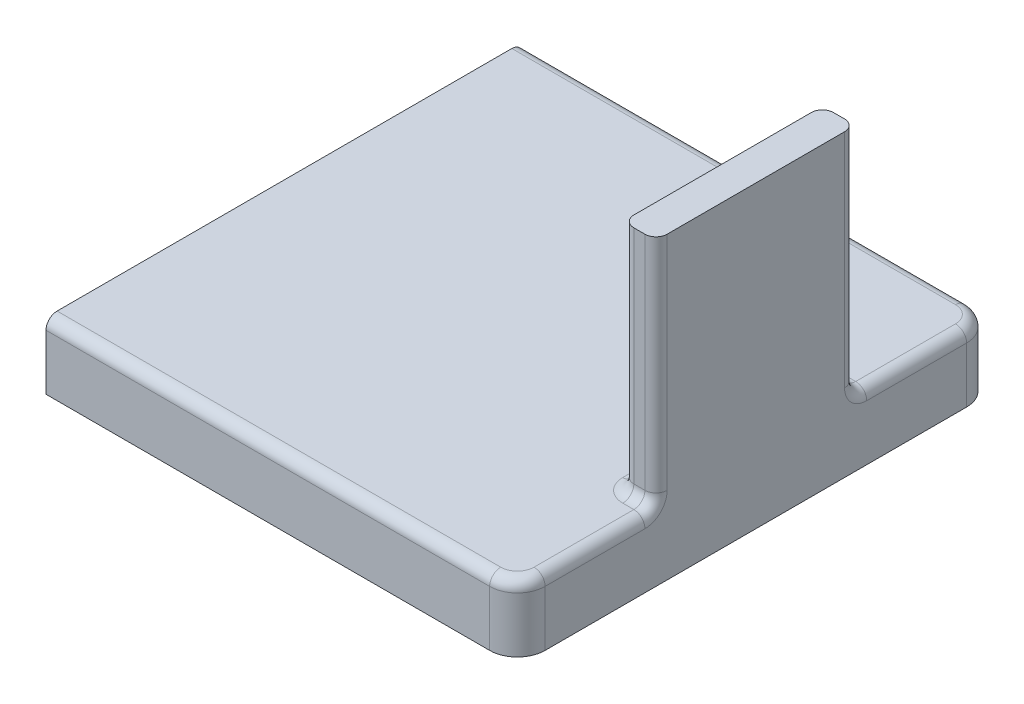
ISO-10303-21;
HEADER;
FILE_DESCRIPTION(('STEP AP214'),'2;1');
FILE_NAME('part.step','',(''),(''),'','','');
FILE_SCHEMA(('AUTOMOTIVE_DESIGN { 1 0 10303 214 1 1 1 1 }'));
ENDSEC;
DATA;
#1=APPLICATION_CONTEXT('core data for automotive mechanical design processes');
#2=APPLICATION_PROTOCOL_DEFINITION('international standard','automotive_design',2000,#1);
#3=PRODUCT_CONTEXT('',#1,'mechanical');
#4=PRODUCT('Part','Part','',(#3));
#5=PRODUCT_RELATED_PRODUCT_CATEGORY('part','',(#4));
#6=PRODUCT_DEFINITION_FORMATION('','',#4);
#7=PRODUCT_DEFINITION_CONTEXT('part definition',#1,'design');
#8=PRODUCT_DEFINITION('design','',#6,#7);
#9=PRODUCT_DEFINITION_SHAPE('','',#8);
#10=(LENGTH_UNIT() NAMED_UNIT(*) SI_UNIT(.MILLI.,.METRE.));
#11=(NAMED_UNIT(*) PLANE_ANGLE_UNIT() SI_UNIT($,.RADIAN.));
#12=(NAMED_UNIT(*) SI_UNIT($,.STERADIAN.) SOLID_ANGLE_UNIT());
#13=UNCERTAINTY_MEASURE_WITH_UNIT(LENGTH_MEASURE(1.E-05),#10,'distance_accuracy_value','');
#14=(GEOMETRIC_REPRESENTATION_CONTEXT(3) GLOBAL_UNCERTAINTY_ASSIGNED_CONTEXT((#13)) GLOBAL_UNIT_ASSIGNED_CONTEXT((#10,
#11,#12)) REPRESENTATION_CONTEXT('',''));
#15=CARTESIAN_POINT('',(0.,0.,0.));
#16=DIRECTION('',(0.,0.,1.));
#17=DIRECTION('',(1.,0.,0.));
#18=AXIS2_PLACEMENT_3D('',#15,#16,#17);
#19=CARTESIAN_POINT('',(85.,-42.,43.));
#20=DIRECTION('',(0.,-1.,0.));
#21=DIRECTION('',(1.,0.,0.));
#22=AXIS2_PLACEMENT_3D('',#19,#20,#21);
#23=PLANE('',#22);
#24=CARTESIAN_POINT('',(80.,-42.,-38.));
#25=DIRECTION('',(0.,-1.,0.));
#26=DIRECTION('',(1.,0.,0.));
#27=AXIS2_PLACEMENT_3D('',#24,#25,#26);
#28=CIRCLE('',#27,3.);
#29=CARTESIAN_POINT('',(83.,-42.,-38.));
#30=VERTEX_POINT('',#29);
#31=CARTESIAN_POINT('',(80.,-42.,-41.));
#32=VERTEX_POINT('',#31);
#33=EDGE_CURVE('E249',#30,#32,#28,.F.);
#34=ORIENTED_EDGE('',*,*,#33,.T.);
#35=DIRECTION('',(-1.,0.,0.));
#36=VECTOR('',#35,1.);
#37=CARTESIAN_POINT('',(85.,-42.,-41.));
#38=LINE('',#37,#36);
#39=CARTESIAN_POINT('',(0.,-42.,-41.));
#40=VERTEX_POINT('',#39);
#41=EDGE_CURVE('E251',#32,#40,#38,.T.);
#42=ORIENTED_EDGE('',*,*,#41,.T.);
#43=DIRECTION('',(0.,0.,-1.));
#44=VECTOR('',#43,1.);
#45=CARTESIAN_POINT('',(0.,-42.,43.));
#46=LINE('',#45,#44);
#47=CARTESIAN_POINT('',(0.,-42.,41.));
#48=VERTEX_POINT('',#47);
#49=EDGE_CURVE('E201',#48,#40,#46,.T.);
#50=ORIENTED_EDGE('',*,*,#49,.F.);
#51=DIRECTION('',(-1.,0.,0.));
#52=VECTOR('',#51,1.);
#53=CARTESIAN_POINT('',(80.,-42.,41.));
#54=LINE('',#53,#52);
#55=CARTESIAN_POINT('',(80.,-42.,41.));
#56=VERTEX_POINT('',#55);
#57=EDGE_CURVE('E235',#48,#56,#54,.F.);
#58=ORIENTED_EDGE('',*,*,#57,.T.);
#59=CARTESIAN_POINT('',(80.,-42.,38.));
#60=DIRECTION('',(0.,-1.,0.));
#61=DIRECTION('',(1.,0.,0.));
#62=AXIS2_PLACEMENT_3D('',#59,#60,#61);
#63=CIRCLE('',#62,3.);
#64=CARTESIAN_POINT('',(83.,-42.,38.));
#65=VERTEX_POINT('',#64);
#66=EDGE_CURVE('E233',#56,#65,#63,.F.);
#67=ORIENTED_EDGE('',*,*,#66,.T.);
#68=DIRECTION('',(0.,0.,-1.));
#69=VECTOR('',#68,1.);
#70=CARTESIAN_POINT('',(83.,-42.,43.));
#71=LINE('',#70,#69);
#72=CARTESIAN_POINT('',(83.,-42.,20.));
#73=VERTEX_POINT('',#72);
#74=EDGE_CURVE('E229',#65,#73,#71,.T.);
#75=ORIENTED_EDGE('',*,*,#74,.T.);
#76=DIRECTION('',(1.,0.,0.));
#77=VECTOR('',#76,1.);
#78=CARTESIAN_POINT('',(85.,-42.,20.));
#79=LINE('',#78,#77);
#80=CARTESIAN_POINT('',(81.,-42.,20.));
#81=VERTEX_POINT('',#80);
#82=EDGE_CURVE('E231',#73,#81,#79,.F.);
#83=ORIENTED_EDGE('',*,*,#82,.T.);
#84=CARTESIAN_POINT('',(81.,-42.,16.));
#85=DIRECTION('',(0.,-1.,0.));
#86=DIRECTION('',(1.,0.,0.));
#87=AXIS2_PLACEMENT_3D('',#84,#85,#86);
#88=CIRCLE('',#87,4.);
#89=CARTESIAN_POINT('',(77.,-42.,16.));
#90=VERTEX_POINT('',#89);
#91=EDGE_CURVE('E237',#90,#81,#88,.F.);
#92=ORIENTED_EDGE('',*,*,#91,.F.);
#93=DIRECTION('',(0.,0.,-1.));
#94=VECTOR('',#93,1.);
#95=CARTESIAN_POINT('',(77.,-42.,-18.));
#96=LINE('',#95,#94);
#97=CARTESIAN_POINT('',(77.,-42.,-16.));
#98=VERTEX_POINT('',#97);
#99=EDGE_CURVE('E240',#90,#98,#96,.T.);
#100=ORIENTED_EDGE('',*,*,#99,.T.);
#101=CARTESIAN_POINT('',(81.,-42.,-16.));
#102=DIRECTION('',(0.,-1.,0.));
#103=DIRECTION('',(1.,0.,0.));
#104=AXIS2_PLACEMENT_3D('',#101,#102,#103);
#105=CIRCLE('',#104,4.);
#106=CARTESIAN_POINT('',(81.,-42.,-20.));
#107=VERTEX_POINT('',#106);
#108=EDGE_CURVE('E242',#107,#98,#105,.F.);
#109=ORIENTED_EDGE('',*,*,#108,.F.);
#110=DIRECTION('',(1.,0.,0.));
#111=VECTOR('',#110,1.);
#112=CARTESIAN_POINT('',(85.,-42.,-20.));
#113=LINE('',#112,#111);
#114=CARTESIAN_POINT('',(83.,-42.,-20.));
#115=VERTEX_POINT('',#114);
#116=EDGE_CURVE('E245',#107,#115,#113,.T.);
#117=ORIENTED_EDGE('',*,*,#116,.T.);
#118=DIRECTION('',(0.,0.,-1.));
#119=VECTOR('',#118,1.);
#120=CARTESIAN_POINT('',(83.,-42.,43.));
#121=LINE('',#120,#119);
#122=EDGE_CURVE('E247',#115,#30,#121,.T.);
#123=ORIENTED_EDGE('',*,*,#122,.T.);
#124=EDGE_LOOP('',(#34,#42,#50,#58,#67,#75,#83,#92,#100,#109,#117,#123));
#125=FACE_BOUND('',#124,.T.);
#126=ADVANCED_FACE('F36',(#125),#23,.F.);
#127=CARTESIAN_POINT('',(0.,-42.,43.));
#128=DIRECTION('',(1.,0.,0.));
#129=DIRECTION('',(0.,1.,0.));
#130=AXIS2_PLACEMENT_3D('',#127,#128,#129);
#131=PLANE('',#130);
#132=ORIENTED_EDGE('',*,*,#49,.T.);
#133=CARTESIAN_POINT('',(0.,-44.,-41.));
#134=DIRECTION('',(1.,0.,0.));
#135=DIRECTION('',(0.,1.,0.));
#136=AXIS2_PLACEMENT_3D('',#133,#134,#135);
#137=CIRCLE('',#136,2.);
#138=CARTESIAN_POINT('',(0.,-44.,-43.));
#139=VERTEX_POINT('',#138);
#140=EDGE_CURVE('E256',#40,#139,#137,.F.);
#141=ORIENTED_EDGE('',*,*,#140,.T.);
#142=DIRECTION('',(0.,-1.,0.));
#143=VECTOR('',#142,1.);
#144=CARTESIAN_POINT('',(0.,-42.,-43.));
#145=LINE('',#144,#143);
#146=CARTESIAN_POINT('',(0.,-54.,-43.));
#147=VERTEX_POINT('',#146);
#148=EDGE_CURVE('E197',#139,#147,#145,.T.);
#149=ORIENTED_EDGE('',*,*,#148,.T.);
#150=DIRECTION('',(0.,0.,-1.));
#151=VECTOR('',#150,1.);
#152=CARTESIAN_POINT('',(0.,-54.,43.));
#153=LINE('',#152,#151);
#154=CARTESIAN_POINT('',(0.,-54.,43.));
#155=VERTEX_POINT('',#154);
#156=EDGE_CURVE('E193',#155,#147,#153,.T.);
#157=ORIENTED_EDGE('',*,*,#156,.F.);
#158=DIRECTION('',(0.,-1.,0.));
#159=VECTOR('',#158,1.);
#160=CARTESIAN_POINT('',(0.,-42.,43.));
#161=LINE('',#160,#159);
#162=CARTESIAN_POINT('',(0.,-44.,43.));
#163=VERTEX_POINT('',#162);
#164=EDGE_CURVE('E179',#163,#155,#161,.T.);
#165=ORIENTED_EDGE('',*,*,#164,.F.);
#166=CARTESIAN_POINT('',(0.,-44.,41.));
#167=DIRECTION('',(1.,0.,0.));
#168=DIRECTION('',(0.,1.,0.));
#169=AXIS2_PLACEMENT_3D('',#166,#167,#168);
#170=CIRCLE('',#169,2.);
#171=EDGE_CURVE('E254',#163,#48,#170,.F.);
#172=ORIENTED_EDGE('',*,*,#171,.T.);
#173=EDGE_LOOP('',(#132,#141,#149,#157,#165,#172));
#174=FACE_BOUND('',#173,.T.);
#175=ADVANCED_FACE('F195',(#174),#131,.F.);
#176=CARTESIAN_POINT('',(0.,-54.,43.));
#177=DIRECTION('',(0.,1.,0.));
#178=DIRECTION('',(-1.,0.,0.));
#179=AXIS2_PLACEMENT_3D('',#176,#177,#178);
#180=PLANE('',#179);
#181=DIRECTION('',(1.,0.,0.));
#182=VECTOR('',#181,1.);
#183=CARTESIAN_POINT('',(0.,-54.,-43.));
#184=LINE('',#183,#182);
#185=CARTESIAN_POINT('',(80.,-54.,-43.));
#186=VERTEX_POINT('',#185);
#187=EDGE_CURVE('E190',#147,#186,#184,.T.);
#188=ORIENTED_EDGE('',*,*,#187,.T.);
#189=CARTESIAN_POINT('',(80.,-54.,-38.));
#190=DIRECTION('',(0.,1.,0.));
#191=DIRECTION('',(-1.,0.,0.));
#192=AXIS2_PLACEMENT_3D('',#189,#190,#191);
#193=CIRCLE('',#192,5.);
#194=CARTESIAN_POINT('',(85.,-54.,-38.));
#195=VERTEX_POINT('',#194);
#196=EDGE_CURVE('E225',#186,#195,#193,.F.);
#197=ORIENTED_EDGE('',*,*,#196,.T.);
#198=DIRECTION('',(0.,0.,-1.));
#199=VECTOR('',#198,1.);
#200=CARTESIAN_POINT('',(85.,-54.,43.));
#201=LINE('',#200,#199);
#202=CARTESIAN_POINT('',(85.,-54.,38.));
#203=VERTEX_POINT('',#202);
#204=EDGE_CURVE('E202',#203,#195,#201,.T.);
#205=ORIENTED_EDGE('',*,*,#204,.F.);
#206=CARTESIAN_POINT('',(80.,-54.,38.));
#207=DIRECTION('',(0.,1.,0.));
#208=DIRECTION('',(-1.,0.,0.));
#209=AXIS2_PLACEMENT_3D('',#206,#207,#208);
#210=CIRCLE('',#209,5.);
#211=CARTESIAN_POINT('',(80.,-54.,43.));
#212=VERTEX_POINT('',#211);
#213=EDGE_CURVE('E207',#203,#212,#210,.F.);
#214=ORIENTED_EDGE('',*,*,#213,.T.);
#215=DIRECTION('',(1.,0.,0.));
#216=VECTOR('',#215,1.);
#217=CARTESIAN_POINT('',(0.,-54.,43.));
#218=LINE('',#217,#216);
#219=EDGE_CURVE('E184',#155,#212,#218,.T.);
#220=ORIENTED_EDGE('',*,*,#219,.F.);
#221=ORIENTED_EDGE('',*,*,#156,.T.);
#222=EDGE_LOOP('',(#188,#197,#205,#214,#220,#221));
#223=FACE_BOUND('',#222,.T.);
#224=ADVANCED_FACE('F204',(#223),#180,.F.);
#225=CARTESIAN_POINT('',(85.,-42.,43.));
#226=DIRECTION('',(-1.,0.,0.));
#227=DIRECTION('',(0.,-1.,0.));
#228=AXIS2_PLACEMENT_3D('',#225,#226,#227);
#229=PLANE('',#228);
#230=DIRECTION('',(0.,1.,0.));
#231=VECTOR('',#230,1.);
#232=CARTESIAN_POINT('',(85.,-42.,-38.));
#233=LINE('',#232,#231);
#234=CARTESIAN_POINT('',(85.,-44.,-38.));
#235=VERTEX_POINT('',#234);
#236=EDGE_CURVE('E219',#195,#235,#233,.T.);
#237=ORIENTED_EDGE('',*,*,#236,.T.);
#238=DIRECTION('',(0.,0.,-1.));
#239=VECTOR('',#238,1.);
#240=CARTESIAN_POINT('',(85.,-44.,43.));
#241=LINE('',#240,#239);
#242=CARTESIAN_POINT('',(85.,-44.,-20.));
#243=VERTEX_POINT('',#242);
#244=EDGE_CURVE('E274',#235,#243,#241,.F.);
#245=ORIENTED_EDGE('',*,*,#244,.T.);
#246=CARTESIAN_POINT('',(85.,-40.,-20.));
#247=DIRECTION('',(-1.,0.,0.));
#248=DIRECTION('',(0.,-1.,0.));
#249=AXIS2_PLACEMENT_3D('',#246,#247,#248);
#250=CIRCLE('',#249,4.);
#251=CARTESIAN_POINT('',(85.,-40.,-16.));
#252=VERTEX_POINT('',#251);
#253=EDGE_CURVE('E271',#252,#243,#250,.F.);
#254=ORIENTED_EDGE('',*,*,#253,.F.);
#255=DIRECTION('',(0.,1.,0.));
#256=VECTOR('',#255,1.);
#257=CARTESIAN_POINT('',(85.,-42.,-16.));
#258=LINE('',#257,#256);
#259=CARTESIAN_POINT('',(85.,0.,-16.));
#260=VERTEX_POINT('',#259);
#261=EDGE_CURVE('E269',#252,#260,#258,.T.);
#262=ORIENTED_EDGE('',*,*,#261,.T.);
#263=DIRECTION('',(0.,0.,-1.));
#264=VECTOR('',#263,1.);
#265=CARTESIAN_POINT('',(85.,0.,18.));
#266=LINE('',#265,#264);
#267=CARTESIAN_POINT('',(85.,0.,16.));
#268=VERTEX_POINT('',#267);
#269=EDGE_CURVE('E214',#268,#260,#266,.T.);
#270=ORIENTED_EDGE('',*,*,#269,.F.);
#271=DIRECTION('',(0.,1.,0.));
#272=VECTOR('',#271,1.);
#273=CARTESIAN_POINT('',(85.,-42.,16.));
#274=LINE('',#273,#272);
#275=CARTESIAN_POINT('',(85.,-40.,16.));
#276=VERTEX_POINT('',#275);
#277=EDGE_CURVE('E265',#268,#276,#274,.F.);
#278=ORIENTED_EDGE('',*,*,#277,.T.);
#279=CARTESIAN_POINT('',(85.,-40.,20.));
#280=DIRECTION('',(-1.,0.,0.));
#281=DIRECTION('',(0.,-1.,0.));
#282=AXIS2_PLACEMENT_3D('',#279,#280,#281);
#283=CIRCLE('',#282,4.);
#284=CARTESIAN_POINT('',(85.,-44.,20.));
#285=VERTEX_POINT('',#284);
#286=EDGE_CURVE('E262',#285,#276,#283,.F.);
#287=ORIENTED_EDGE('',*,*,#286,.F.);
#288=DIRECTION('',(0.,0.,-1.));
#289=VECTOR('',#288,1.);
#290=CARTESIAN_POINT('',(85.,-44.,43.));
#291=LINE('',#290,#289);
#292=CARTESIAN_POINT('',(85.,-44.,38.));
#293=VERTEX_POINT('',#292);
#294=EDGE_CURVE('E267',#285,#293,#291,.F.);
#295=ORIENTED_EDGE('',*,*,#294,.T.);
#296=DIRECTION('',(0.,1.,0.));
#297=VECTOR('',#296,1.);
#298=CARTESIAN_POINT('',(85.,-54.,38.));
#299=LINE('',#298,#297);
#300=EDGE_CURVE('E217',#293,#203,#299,.F.);
#301=ORIENTED_EDGE('',*,*,#300,.T.);
#302=ORIENTED_EDGE('',*,*,#204,.T.);
#303=EDGE_LOOP('',(#237,#245,#254,#262,#270,#278,#287,#295,#301,#302));
#304=FACE_BOUND('',#303,.T.);
#305=ADVANCED_FACE('F504',(#304),#229,.F.);
#306=CARTESIAN_POINT('',(0.,-42.,43.));
#307=DIRECTION('',(0.,0.,1.));
#308=DIRECTION('',(1.,0.,0.));
#309=AXIS2_PLACEMENT_3D('',#306,#307,#308);
#310=PLANE('',#309);
#311=DIRECTION('',(0.,1.,0.));
#312=VECTOR('',#311,1.);
#313=CARTESIAN_POINT('',(80.,-42.,43.));
#314=LINE('',#313,#312);
#315=CARTESIAN_POINT('',(80.,-44.,43.));
#316=VERTEX_POINT('',#315);
#317=EDGE_CURVE('E227',#212,#316,#314,.T.);
#318=ORIENTED_EDGE('',*,*,#317,.T.);
#319=DIRECTION('',(-1.,0.,0.));
#320=VECTOR('',#319,1.);
#321=CARTESIAN_POINT('',(0.,-44.,43.));
#322=LINE('',#321,#320);
#323=EDGE_CURVE('E187',#316,#163,#322,.T.);
#324=ORIENTED_EDGE('',*,*,#323,.T.);
#325=ORIENTED_EDGE('',*,*,#164,.T.);
#326=ORIENTED_EDGE('',*,*,#219,.T.);
#327=EDGE_LOOP('',(#318,#324,#325,#326));
#328=FACE_BOUND('',#327,.T.);
#329=ADVANCED_FACE('F182',(#328),#310,.T.);
#330=CARTESIAN_POINT('',(0.,-42.,-43.));
#331=DIRECTION('',(0.,0.,1.));
#332=DIRECTION('',(1.,0.,0.));
#333=AXIS2_PLACEMENT_3D('',#330,#331,#332);
#334=PLANE('',#333);
#335=ORIENTED_EDGE('',*,*,#148,.F.);
#336=DIRECTION('',(-1.,0.,0.));
#337=VECTOR('',#336,1.);
#338=CARTESIAN_POINT('',(0.,-44.,-43.));
#339=LINE('',#338,#337);
#340=CARTESIAN_POINT('',(80.,-44.,-43.));
#341=VERTEX_POINT('',#340);
#342=EDGE_CURVE('E258',#139,#341,#339,.F.);
#343=ORIENTED_EDGE('',*,*,#342,.T.);
#344=DIRECTION('',(0.,1.,0.));
#345=VECTOR('',#344,1.);
#346=CARTESIAN_POINT('',(80.,-41.9999999999999,-43.));
#347=LINE('',#346,#345);
#348=EDGE_CURVE('E222',#341,#186,#347,.F.);
#349=ORIENTED_EDGE('',*,*,#348,.T.);
#350=ORIENTED_EDGE('',*,*,#187,.F.);
#351=EDGE_LOOP('',(#335,#343,#349,#350));
#352=FACE_BOUND('',#351,.T.);
#353=ADVANCED_FACE('F498',(#352),#334,.F.);
#354=CARTESIAN_POINT('',(85.,0.,18.));
#355=DIRECTION('',(0.,-1.,0.));
#356=DIRECTION('',(1.,0.,0.));
#357=AXIS2_PLACEMENT_3D('',#354,#355,#356);
#358=PLANE('',#357);
#359=DIRECTION('',(-1.,0.,0.));
#360=VECTOR('',#359,1.);
#361=CARTESIAN_POINT('',(85.,0.,-18.));
#362=LINE('',#361,#360);
#363=CARTESIAN_POINT('',(82.9999999999999,0.,-18.));
#364=VERTEX_POINT('',#363);
#365=CARTESIAN_POINT('',(81.,0.,-18.));
#366=VERTEX_POINT('',#365);
#367=EDGE_CURVE('E348',#364,#366,#362,.T.);
#368=ORIENTED_EDGE('',*,*,#367,.T.);
#369=CARTESIAN_POINT('',(81.,0.,-16.));
#370=DIRECTION('',(0.,-1.,0.));
#371=DIRECTION('',(1.,0.,0.));
#372=AXIS2_PLACEMENT_3D('',#369,#370,#371);
#373=CIRCLE('',#372,2.);
#374=CARTESIAN_POINT('',(79.,0.,-16.));
#375=VERTEX_POINT('',#374);
#376=EDGE_CURVE('E11',#366,#375,#373,.F.);
#377=ORIENTED_EDGE('',*,*,#376,.T.);
#378=DIRECTION('',(0.,0.,-1.));
#379=VECTOR('',#378,1.);
#380=CARTESIAN_POINT('',(79.,0.,18.));
#381=LINE('',#380,#379);
#382=CARTESIAN_POINT('',(79.,0.,16.));
#383=VERTEX_POINT('',#382);
#384=EDGE_CURVE('E359',#383,#375,#381,.T.);
#385=ORIENTED_EDGE('',*,*,#384,.F.);
#386=CARTESIAN_POINT('',(81.,0.,16.));
#387=DIRECTION('',(0.,-1.,0.));
#388=DIRECTION('',(1.,0.,0.));
#389=AXIS2_PLACEMENT_3D('',#386,#387,#388);
#390=CIRCLE('',#389,2.);
#391=CARTESIAN_POINT('',(81.,0.,18.));
#392=VERTEX_POINT('',#391);
#393=EDGE_CURVE('E295',#383,#392,#390,.F.);
#394=ORIENTED_EDGE('',*,*,#393,.T.);
#395=DIRECTION('',(-1.,0.,0.));
#396=VECTOR('',#395,1.);
#397=CARTESIAN_POINT('',(85.,0.,18.));
#398=LINE('',#397,#396);
#399=CARTESIAN_POINT('',(82.9999999999999,0.,18.));
#400=VERTEX_POINT('',#399);
#401=EDGE_CURVE('E354',#400,#392,#398,.T.);
#402=ORIENTED_EDGE('',*,*,#401,.F.);
#403=CARTESIAN_POINT('',(82.9999999999999,0.,16.));
#404=DIRECTION('',(0.,-1.,0.));
#405=DIRECTION('',(1.,0.,0.));
#406=AXIS2_PLACEMENT_3D('',#403,#404,#405);
#407=CIRCLE('',#406,2.);
#408=EDGE_CURVE('E297',#400,#268,#407,.F.);
#409=ORIENTED_EDGE('',*,*,#408,.T.);
#410=ORIENTED_EDGE('',*,*,#269,.T.);
#411=CARTESIAN_POINT('',(82.9999999999999,0.,-16.));
#412=DIRECTION('',(0.,-1.,0.));
#413=DIRECTION('',(1.,0.,0.));
#414=AXIS2_PLACEMENT_3D('',#411,#412,#413);
#415=CIRCLE('',#414,2.);
#416=EDGE_CURVE('E45',#260,#364,#415,.F.);
#417=ORIENTED_EDGE('',*,*,#416,.T.);
#418=EDGE_LOOP('',(#368,#377,#385,#394,#402,#409,#410,#417));
#419=FACE_BOUND('',#418,.T.);
#420=ADVANCED_FACE('F366',(#419),#358,.F.);
#421=CARTESIAN_POINT('',(79.,0.,18.));
#422=DIRECTION('',(1.,0.,0.));
#423=DIRECTION('',(0.,0.,-1.));
#424=AXIS2_PLACEMENT_3D('',#421,#422,#423);
#425=PLANE('',#424);
#426=ORIENTED_EDGE('',*,*,#384,.T.);
#427=DIRECTION('',(0.,-1.,0.));
#428=VECTOR('',#427,1.);
#429=CARTESIAN_POINT('',(79.,0.,-16.));
#430=LINE('',#429,#428);
#431=CARTESIAN_POINT('',(79.,-40.,-16.));
#432=VERTEX_POINT('',#431);
#433=EDGE_CURVE('E286',#375,#432,#430,.T.);
#434=ORIENTED_EDGE('',*,*,#433,.T.);
#435=DIRECTION('',(0.,0.,-1.));
#436=VECTOR('',#435,1.);
#437=CARTESIAN_POINT('',(79.,-40.,18.));
#438=LINE('',#437,#436);
#439=CARTESIAN_POINT('',(79.,-40.,16.));
#440=VERTEX_POINT('',#439);
#441=EDGE_CURVE('E284',#432,#440,#438,.F.);
#442=ORIENTED_EDGE('',*,*,#441,.T.);
#443=DIRECTION('',(0.,-1.,0.));
#444=VECTOR('',#443,1.);
#445=CARTESIAN_POINT('',(79.,0.,16.));
#446=LINE('',#445,#444);
#447=EDGE_CURVE('E282',#440,#383,#446,.F.);
#448=ORIENTED_EDGE('',*,*,#447,.T.);
#449=EDGE_LOOP('',(#426,#434,#442,#448));
#450=FACE_BOUND('',#449,.T.);
#451=ADVANCED_FACE('F396',(#450),#425,.F.);
#452=CARTESIAN_POINT('',(85.,-42.,18.));
#453=DIRECTION('',(0.,0.,1.));
#454=DIRECTION('',(1.,0.,0.));
#455=AXIS2_PLACEMENT_3D('',#452,#453,#454);
#456=PLANE('',#455);
#457=DIRECTION('',(1.,0.,0.));
#458=VECTOR('',#457,1.);
#459=CARTESIAN_POINT('',(85.,-40.,18.));
#460=LINE('',#459,#458);
#461=CARTESIAN_POINT('',(81.,-40.,18.));
#462=VERTEX_POINT('',#461);
#463=CARTESIAN_POINT('',(83.,-40.,18.));
#464=VERTEX_POINT('',#463);
#465=EDGE_CURVE('E53',#462,#464,#460,.T.);
#466=ORIENTED_EDGE('',*,*,#465,.T.);
#467=DIRECTION('',(0.,1.,0.));
#468=VECTOR('',#467,1.);
#469=CARTESIAN_POINT('',(82.9999999999999,0.,18.));
#470=LINE('',#469,#468);
#471=EDGE_CURVE('E293',#464,#400,#470,.T.);
#472=ORIENTED_EDGE('',*,*,#471,.T.);
#473=ORIENTED_EDGE('',*,*,#401,.T.);
#474=DIRECTION('',(0.,-1.,0.));
#475=VECTOR('',#474,1.);
#476=CARTESIAN_POINT('',(81.,-42.,18.));
#477=LINE('',#476,#475);
#478=EDGE_CURVE('E58',#392,#462,#477,.T.);
#479=ORIENTED_EDGE('',*,*,#478,.T.);
#480=EDGE_LOOP('',(#466,#472,#473,#479));
#481=FACE_BOUND('',#480,.T.);
#482=ADVANCED_FACE('F420',(#481),#456,.T.);
#483=CARTESIAN_POINT('',(85.,-42.,-18.));
#484=DIRECTION('',(0.,0.,1.));
#485=DIRECTION('',(1.,0.,0.));
#486=AXIS2_PLACEMENT_3D('',#483,#484,#485);
#487=PLANE('',#486);
#488=DIRECTION('',(1.,0.,0.));
#489=VECTOR('',#488,1.);
#490=CARTESIAN_POINT('',(79.,-40.,-18.));
#491=LINE('',#490,#489);
#492=CARTESIAN_POINT('',(83.,-40.,-18.));
#493=VERTEX_POINT('',#492);
#494=CARTESIAN_POINT('',(81.,-40.,-18.));
#495=VERTEX_POINT('',#494);
#496=EDGE_CURVE('E278',#493,#495,#491,.F.);
#497=ORIENTED_EDGE('',*,*,#496,.T.);
#498=DIRECTION('',(0.,-1.,0.));
#499=VECTOR('',#498,1.);
#500=CARTESIAN_POINT('',(81.,-42.,-18.));
#501=LINE('',#500,#499);
#502=EDGE_CURVE('E280',#495,#366,#501,.F.);
#503=ORIENTED_EDGE('',*,*,#502,.T.);
#504=ORIENTED_EDGE('',*,*,#367,.F.);
#505=DIRECTION('',(0.,1.,0.));
#506=VECTOR('',#505,1.);
#507=CARTESIAN_POINT('',(83.,-42.,-18.));
#508=LINE('',#507,#506);
#509=EDGE_CURVE('E276',#364,#493,#508,.F.);
#510=ORIENTED_EDGE('',*,*,#509,.T.);
#511=EDGE_LOOP('',(#497,#503,#504,#510));
#512=FACE_BOUND('',#511,.T.);
#513=ADVANCED_FACE('F378',(#512),#487,.F.);
#514=CARTESIAN_POINT('',(80.,-42.,-38.));
#515=DIRECTION('',(0.,1.,0.));
#516=DIRECTION('',(-1.,0.,0.));
#517=AXIS2_PLACEMENT_3D('',#514,#515,#516);
#518=CYLINDRICAL_SURFACE('',#517,5.);
#519=ORIENTED_EDGE('',*,*,#348,.F.);
#520=CARTESIAN_POINT('',(80.,-44.,-38.));
#521=DIRECTION('',(0.,-1.,0.));
#522=DIRECTION('',(1.,0.,0.));
#523=AXIS2_PLACEMENT_3D('',#520,#521,#522);
#524=CIRCLE('',#523,5.);
#525=EDGE_CURVE('E260',#341,#235,#524,.T.);
#526=ORIENTED_EDGE('',*,*,#525,.T.);
#527=ORIENTED_EDGE('',*,*,#236,.F.);
#528=ORIENTED_EDGE('',*,*,#196,.F.);
#529=EDGE_LOOP('',(#519,#526,#527,#528));
#530=FACE_BOUND('',#529,.T.);
#531=ADVANCED_FACE('F427',(#530),#518,.T.);
#532=CARTESIAN_POINT('',(80.,-41.9999999999999,38.));
#533=DIRECTION('',(0.,-1.,0.));
#534=DIRECTION('',(1.,0.,0.));
#535=AXIS2_PLACEMENT_3D('',#532,#533,#534);
#536=CYLINDRICAL_SURFACE('',#535,5.);
#537=ORIENTED_EDGE('',*,*,#300,.F.);
#538=CARTESIAN_POINT('',(80.,-44.,38.));
#539=DIRECTION('',(0.,-1.,0.));
#540=DIRECTION('',(1.,0.,0.));
#541=AXIS2_PLACEMENT_3D('',#538,#539,#540);
#542=CIRCLE('',#541,5.);
#543=EDGE_CURVE('E289',#293,#316,#542,.T.);
#544=ORIENTED_EDGE('',*,*,#543,.T.);
#545=ORIENTED_EDGE('',*,*,#317,.F.);
#546=ORIENTED_EDGE('',*,*,#213,.F.);
#547=EDGE_LOOP('',(#537,#544,#545,#546));
#548=FACE_BOUND('',#547,.T.);
#549=ADVANCED_FACE('F440',(#548),#536,.T.);
#550=CARTESIAN_POINT('',(0.,-44.,41.));
#551=DIRECTION('',(1.,0.,0.));
#552=DIRECTION('',(0.,1.,0.));
#553=AXIS2_PLACEMENT_3D('',#550,#551,#552);
#554=CYLINDRICAL_SURFACE('',#553,2.);
#555=ORIENTED_EDGE('',*,*,#171,.F.);
#556=ORIENTED_EDGE('',*,*,#323,.F.);
#557=CARTESIAN_POINT('',(80.,-44.,41.));
#558=DIRECTION('',(1.,0.,0.));
#559=DIRECTION('',(0.,0.,-1.));
#560=AXIS2_PLACEMENT_3D('',#557,#558,#559);
#561=CIRCLE('',#560,2.);
#562=EDGE_CURVE('E40',#56,#316,#561,.T.);
#563=ORIENTED_EDGE('',*,*,#562,.F.);
#564=ORIENTED_EDGE('',*,*,#57,.F.);
#565=EDGE_LOOP('',(#555,#556,#563,#564));
#566=FACE_BOUND('',#565,.T.);
#567=ADVANCED_FACE('F38',(#566),#554,.T.);
#568=CARTESIAN_POINT('',(80.,-44.,38.));
#569=DIRECTION('',(0.,-1.,0.));
#570=DIRECTION('',(1.,0.,0.));
#571=AXIS2_PLACEMENT_3D('',#568,#569,#570);
#572=TOROIDAL_SURFACE('',#571,3.,2.);
#573=ORIENTED_EDGE('',*,*,#562,.T.);
#574=ORIENTED_EDGE('',*,*,#543,.F.);
#575=CARTESIAN_POINT('',(83.,-44.,38.));
#576=DIRECTION('',(0.,0.,-1.));
#577=DIRECTION('',(-1.,0.,0.));
#578=AXIS2_PLACEMENT_3D('',#575,#576,#577);
#579=CIRCLE('',#578,2.);
#580=EDGE_CURVE('E341',#65,#293,#579,.T.);
#581=ORIENTED_EDGE('',*,*,#580,.F.);
#582=ORIENTED_EDGE('',*,*,#66,.F.);
#583=EDGE_LOOP('',(#573,#574,#581,#582));
#584=FACE_BOUND('',#583,.T.);
#585=ADVANCED_FACE('F483',(#584),#572,.T.);
#586=CARTESIAN_POINT('',(83.,-42.,16.));
#587=DIRECTION('',(0.,-1.,0.));
#588=DIRECTION('',(1.,0.,0.));
#589=AXIS2_PLACEMENT_3D('',#586,#587,#588);
#590=CYLINDRICAL_SURFACE('',#589,2.);
#591=ORIENTED_EDGE('',*,*,#408,.F.);
#592=ORIENTED_EDGE('',*,*,#471,.F.);
#593=CARTESIAN_POINT('',(83.,-40.,16.));
#594=DIRECTION('',(0.,-1.,0.));
#595=DIRECTION('',(0.,0.,-1.));
#596=AXIS2_PLACEMENT_3D('',#593,#594,#595);
#597=CIRCLE('',#596,2.);
#598=EDGE_CURVE('E339',#276,#464,#597,.T.);
#599=ORIENTED_EDGE('',*,*,#598,.F.);
#600=ORIENTED_EDGE('',*,*,#277,.F.);
#601=EDGE_LOOP('',(#591,#592,#599,#600));
#602=FACE_BOUND('',#601,.T.);
#603=ADVANCED_FACE('F419',(#602),#590,.T.);
#604=CARTESIAN_POINT('',(83.,-44.,43.));
#605=DIRECTION('',(0.,0.,-1.));
#606=DIRECTION('',(-1.,0.,0.));
#607=AXIS2_PLACEMENT_3D('',#604,#605,#606);
#608=CYLINDRICAL_SURFACE('',#607,2.);
#609=ORIENTED_EDGE('',*,*,#580,.T.);
#610=ORIENTED_EDGE('',*,*,#294,.F.);
#611=CARTESIAN_POINT('',(83.,-44.,20.));
#612=DIRECTION('',(0.,0.,-1.));
#613=DIRECTION('',(-1.,0.,0.));
#614=AXIS2_PLACEMENT_3D('',#611,#612,#613);
#615=CIRCLE('',#614,2.);
#616=EDGE_CURVE('E336',#73,#285,#615,.T.);
#617=ORIENTED_EDGE('',*,*,#616,.F.);
#618=ORIENTED_EDGE('',*,*,#74,.F.);
#619=EDGE_LOOP('',(#609,#610,#617,#618));
#620=FACE_BOUND('',#619,.T.);
#621=ADVANCED_FACE('F479',(#620),#608,.T.);
#622=CARTESIAN_POINT('',(83.,-40.,20.));
#623=DIRECTION('',(-1.,0.,0.));
#624=DIRECTION('',(0.,-1.,0.));
#625=AXIS2_PLACEMENT_3D('',#622,#623,#624);
#626=TOROIDAL_SURFACE('',#625,4.,2.);
#627=ORIENTED_EDGE('',*,*,#286,.T.);
#628=ORIENTED_EDGE('',*,*,#598,.T.);
#629=CARTESIAN_POINT('',(83.,-40.,20.));
#630=DIRECTION('',(-1.,0.,0.));
#631=DIRECTION('',(0.,-1.,0.));
#632=AXIS2_PLACEMENT_3D('',#629,#630,#631);
#633=CIRCLE('',#632,2.);
#634=EDGE_CURVE('E333',#73,#464,#633,.F.);
#635=ORIENTED_EDGE('',*,*,#634,.F.);
#636=ORIENTED_EDGE('',*,*,#616,.T.);
#637=EDGE_LOOP('',(#627,#628,#635,#636));
#638=FACE_BOUND('',#637,.T.);
#639=ADVANCED_FACE('F416',(#638),#626,.T.);
#640=CARTESIAN_POINT('',(81.,-42.,16.));
#641=DIRECTION('',(0.,1.,0.));
#642=DIRECTION('',(0.,0.,1.));
#643=AXIS2_PLACEMENT_3D('',#640,#641,#642);
#644=CYLINDRICAL_SURFACE('',#643,2.);
#645=ORIENTED_EDGE('',*,*,#393,.F.);
#646=ORIENTED_EDGE('',*,*,#447,.F.);
#647=CARTESIAN_POINT('',(81.,-40.,16.));
#648=DIRECTION('',(0.,-1.,0.));
#649=DIRECTION('',(1.,0.,0.));
#650=AXIS2_PLACEMENT_3D('',#647,#648,#649);
#651=CIRCLE('',#650,2.);
#652=EDGE_CURVE('E330',#462,#440,#651,.T.);
#653=ORIENTED_EDGE('',*,*,#652,.F.);
#654=ORIENTED_EDGE('',*,*,#478,.F.);
#655=EDGE_LOOP('',(#645,#646,#653,#654));
#656=FACE_BOUND('',#655,.T.);
#657=ADVANCED_FACE('F401',(#656),#644,.T.);
#658=CARTESIAN_POINT('',(85.,-40.,20.));
#659=DIRECTION('',(1.,0.,0.));
#660=DIRECTION('',(0.,1.,0.));
#661=AXIS2_PLACEMENT_3D('',#658,#659,#660);
#662=CYLINDRICAL_SURFACE('',#661,2.);
#663=ORIENTED_EDGE('',*,*,#634,.T.);
#664=ORIENTED_EDGE('',*,*,#465,.F.);
#665=CARTESIAN_POINT('',(81.,-40.,20.));
#666=DIRECTION('',(1.,0.,0.));
#667=DIRECTION('',(0.,0.,-1.));
#668=AXIS2_PLACEMENT_3D('',#665,#666,#667);
#669=CIRCLE('',#668,2.);
#670=EDGE_CURVE('E327',#81,#462,#669,.T.);
#671=ORIENTED_EDGE('',*,*,#670,.F.);
#672=ORIENTED_EDGE('',*,*,#82,.F.);
#673=EDGE_LOOP('',(#663,#664,#671,#672));
#674=FACE_BOUND('',#673,.T.);
#675=ADVANCED_FACE('F413',(#674),#662,.F.);
#676=CARTESIAN_POINT('',(81.,-40.,16.));
#677=DIRECTION('',(0.,-1.,0.));
#678=DIRECTION('',(1.,0.,0.));
#679=AXIS2_PLACEMENT_3D('',#676,#677,#678);
#680=TOROIDAL_SURFACE('',#679,4.,2.);
#681=ORIENTED_EDGE('',*,*,#670,.T.);
#682=ORIENTED_EDGE('',*,*,#652,.T.);
#683=CARTESIAN_POINT('',(77.,-40.,16.));
#684=DIRECTION('',(0.,0.,-1.));
#685=DIRECTION('',(-1.,0.,0.));
#686=AXIS2_PLACEMENT_3D('',#683,#684,#685);
#687=CIRCLE('',#686,2.);
#688=EDGE_CURVE('E324',#90,#440,#687,.F.);
#689=ORIENTED_EDGE('',*,*,#688,.F.);
#690=ORIENTED_EDGE('',*,*,#91,.T.);
#691=EDGE_LOOP('',(#681,#682,#689,#690));
#692=FACE_BOUND('',#691,.T.);
#693=ADVANCED_FACE('F404',(#692),#680,.F.);
#694=CARTESIAN_POINT('',(81.,0.,-16.));
#695=DIRECTION('',(0.,-1.,0.));
#696=DIRECTION('',(0.,0.,-1.));
#697=AXIS2_PLACEMENT_3D('',#694,#695,#696);
#698=CYLINDRICAL_SURFACE('',#697,2.);
#699=ORIENTED_EDGE('',*,*,#376,.F.);
#700=ORIENTED_EDGE('',*,*,#502,.F.);
#701=CARTESIAN_POINT('',(81.,-40.,-16.));
#702=DIRECTION('',(0.,-1.,0.));
#703=DIRECTION('',(1.,0.,0.));
#704=AXIS2_PLACEMENT_3D('',#701,#702,#703);
#705=CIRCLE('',#704,2.);
#706=EDGE_CURVE('E321',#432,#495,#705,.T.);
#707=ORIENTED_EDGE('',*,*,#706,.F.);
#708=ORIENTED_EDGE('',*,*,#433,.F.);
#709=EDGE_LOOP('',(#699,#700,#707,#708));
#710=FACE_BOUND('',#709,.T.);
#711=ADVANCED_FACE('F392',(#710),#698,.T.);
#712=CARTESIAN_POINT('',(77.,-40.,43.));
#713=DIRECTION('',(0.,0.,1.));
#714=DIRECTION('',(1.,0.,0.));
#715=AXIS2_PLACEMENT_3D('',#712,#713,#714);
#716=CYLINDRICAL_SURFACE('',#715,2.);
#717=ORIENTED_EDGE('',*,*,#688,.T.);
#718=ORIENTED_EDGE('',*,*,#441,.F.);
#719=CARTESIAN_POINT('',(77.,-40.,-16.));
#720=DIRECTION('',(0.,0.,1.));
#721=DIRECTION('',(1.,0.,0.));
#722=AXIS2_PLACEMENT_3D('',#719,#720,#721);
#723=CIRCLE('',#722,2.);
#724=EDGE_CURVE('E318',#98,#432,#723,.T.);
#725=ORIENTED_EDGE('',*,*,#724,.F.);
#726=ORIENTED_EDGE('',*,*,#99,.F.);
#727=EDGE_LOOP('',(#717,#718,#725,#726));
#728=FACE_BOUND('',#727,.T.);
#729=ADVANCED_FACE('F408',(#728),#716,.F.);
#730=CARTESIAN_POINT('',(81.,-40.,-16.));
#731=DIRECTION('',(0.,-1.,0.));
#732=DIRECTION('',(1.,0.,0.));
#733=AXIS2_PLACEMENT_3D('',#730,#731,#732);
#734=TOROIDAL_SURFACE('',#733,4.,2.);
#735=ORIENTED_EDGE('',*,*,#724,.T.);
#736=ORIENTED_EDGE('',*,*,#706,.T.);
#737=CARTESIAN_POINT('',(81.,-40.,-20.));
#738=DIRECTION('',(1.,0.,0.));
#739=DIRECTION('',(0.,0.,-1.));
#740=AXIS2_PLACEMENT_3D('',#737,#738,#739);
#741=CIRCLE('',#740,2.);
#742=EDGE_CURVE('E315',#107,#495,#741,.F.);
#743=ORIENTED_EDGE('',*,*,#742,.F.);
#744=ORIENTED_EDGE('',*,*,#108,.T.);
#745=EDGE_LOOP('',(#735,#736,#743,#744));
#746=FACE_BOUND('',#745,.T.);
#747=ADVANCED_FACE('F387',(#746),#734,.F.);
#748=CARTESIAN_POINT('',(83.,-42.,-16.));
#749=DIRECTION('',(0.,1.,0.));
#750=DIRECTION('',(-1.,0.,0.));
#751=AXIS2_PLACEMENT_3D('',#748,#749,#750);
#752=CYLINDRICAL_SURFACE('',#751,2.);
#753=ORIENTED_EDGE('',*,*,#416,.F.);
#754=ORIENTED_EDGE('',*,*,#261,.F.);
#755=CARTESIAN_POINT('',(83.,-40.,-16.));
#756=DIRECTION('',(0.,-1.,0.));
#757=DIRECTION('',(0.,0.,-1.));
#758=AXIS2_PLACEMENT_3D('',#755,#756,#757);
#759=CIRCLE('',#758,2.);
#760=EDGE_CURVE('E312',#493,#252,#759,.T.);
#761=ORIENTED_EDGE('',*,*,#760,.F.);
#762=ORIENTED_EDGE('',*,*,#509,.F.);
#763=EDGE_LOOP('',(#753,#754,#761,#762));
#764=FACE_BOUND('',#763,.T.);
#765=ADVANCED_FACE('F374',(#764),#752,.T.);
#766=CARTESIAN_POINT('',(85.,-40.,-20.));
#767=DIRECTION('',(-1.,0.,0.));
#768=DIRECTION('',(0.,-1.,0.));
#769=AXIS2_PLACEMENT_3D('',#766,#767,#768);
#770=CYLINDRICAL_SURFACE('',#769,2.);
#771=ORIENTED_EDGE('',*,*,#742,.T.);
#772=ORIENTED_EDGE('',*,*,#496,.F.);
#773=CARTESIAN_POINT('',(83.,-40.,-20.));
#774=DIRECTION('',(-1.,0.,0.));
#775=DIRECTION('',(0.,-1.,0.));
#776=AXIS2_PLACEMENT_3D('',#773,#774,#775);
#777=CIRCLE('',#776,2.);
#778=EDGE_CURVE('E309',#115,#493,#777,.T.);
#779=ORIENTED_EDGE('',*,*,#778,.F.);
#780=ORIENTED_EDGE('',*,*,#116,.F.);
#781=EDGE_LOOP('',(#771,#772,#779,#780));
#782=FACE_BOUND('',#781,.T.);
#783=ADVANCED_FACE('F382',(#782),#770,.F.);
#784=CARTESIAN_POINT('',(83.,-40.,-20.));
#785=DIRECTION('',(-1.,0.,0.));
#786=DIRECTION('',(0.,-1.,0.));
#787=AXIS2_PLACEMENT_3D('',#784,#785,#786);
#788=TOROIDAL_SURFACE('',#787,4.,2.);
#789=ORIENTED_EDGE('',*,*,#760,.T.);
#790=ORIENTED_EDGE('',*,*,#253,.T.);
#791=CARTESIAN_POINT('',(83.,-44.,-20.));
#792=DIRECTION('',(0.,0.,1.));
#793=DIRECTION('',(1.,0.,0.));
#794=AXIS2_PLACEMENT_3D('',#791,#792,#793);
#795=CIRCLE('',#794,2.);
#796=EDGE_CURVE('E306',#115,#243,#795,.F.);
#797=ORIENTED_EDGE('',*,*,#796,.F.);
#798=ORIENTED_EDGE('',*,*,#778,.T.);
#799=EDGE_LOOP('',(#789,#790,#797,#798));
#800=FACE_BOUND('',#799,.T.);
#801=ADVANCED_FACE('F456',(#800),#788,.T.);
#802=CARTESIAN_POINT('',(83.,-44.,43.));
#803=DIRECTION('',(0.,0.,-1.));
#804=DIRECTION('',(-1.,0.,0.));
#805=AXIS2_PLACEMENT_3D('',#802,#803,#804);
#806=CYLINDRICAL_SURFACE('',#805,2.);
#807=ORIENTED_EDGE('',*,*,#796,.T.);
#808=ORIENTED_EDGE('',*,*,#244,.F.);
#809=CARTESIAN_POINT('',(83.,-44.,-38.));
#810=DIRECTION('',(0.,0.,-1.));
#811=DIRECTION('',(-1.,0.,0.));
#812=AXIS2_PLACEMENT_3D('',#809,#810,#811);
#813=CIRCLE('',#812,2.);
#814=EDGE_CURVE('E303',#30,#235,#813,.T.);
#815=ORIENTED_EDGE('',*,*,#814,.F.);
#816=ORIENTED_EDGE('',*,*,#122,.F.);
#817=EDGE_LOOP('',(#807,#808,#815,#816));
#818=FACE_BOUND('',#817,.T.);
#819=ADVANCED_FACE('F452',(#818),#806,.T.);
#820=CARTESIAN_POINT('',(80.,-44.,-38.));
#821=DIRECTION('',(0.,-1.,0.));
#822=DIRECTION('',(1.,0.,0.));
#823=AXIS2_PLACEMENT_3D('',#820,#821,#822);
#824=TOROIDAL_SURFACE('',#823,3.,2.);
#825=ORIENTED_EDGE('',*,*,#814,.T.);
#826=ORIENTED_EDGE('',*,*,#525,.F.);
#827=CARTESIAN_POINT('',(80.,-44.,-41.));
#828=DIRECTION('',(-1.,0.,0.));
#829=DIRECTION('',(0.,0.,1.));
#830=AXIS2_PLACEMENT_3D('',#827,#828,#829);
#831=CIRCLE('',#830,2.);
#832=EDGE_CURVE('E300',#32,#341,#831,.T.);
#833=ORIENTED_EDGE('',*,*,#832,.F.);
#834=ORIENTED_EDGE('',*,*,#33,.F.);
#835=EDGE_LOOP('',(#825,#826,#833,#834));
#836=FACE_BOUND('',#835,.T.);
#837=ADVANCED_FACE('F448',(#836),#824,.T.);
#838=CARTESIAN_POINT('',(85.,-44.,-41.));
#839=DIRECTION('',(-1.,0.,0.));
#840=DIRECTION('',(0.,-1.,0.));
#841=AXIS2_PLACEMENT_3D('',#838,#839,#840);
#842=CYLINDRICAL_SURFACE('',#841,2.);
#843=ORIENTED_EDGE('',*,*,#832,.T.);
#844=ORIENTED_EDGE('',*,*,#342,.F.);
#845=ORIENTED_EDGE('',*,*,#140,.F.);
#846=ORIENTED_EDGE('',*,*,#41,.F.);
#847=EDGE_LOOP('',(#843,#844,#845,#846));
#848=FACE_BOUND('',#847,.T.);
#849=ADVANCED_FACE('F445',(#848),#842,.T.);
#850=CLOSED_SHELL('',(#126,#175,#224,#305,#329,#353,#420,#451,#482,#513,#531,#549,#567,#585,
#603,#621,#639,#657,#675,#693,#711,#729,#747,#765,#783,#801,#819,#837,#849));
#851=MANIFOLD_SOLID_BREP('B2',#850);
#852=ADVANCED_BREP_SHAPE_REPRESENTATION('',(#18,#851),#14);
#853=SHAPE_DEFINITION_REPRESENTATION(#9,#852);
ENDSEC;
END-ISO-10303-21;
